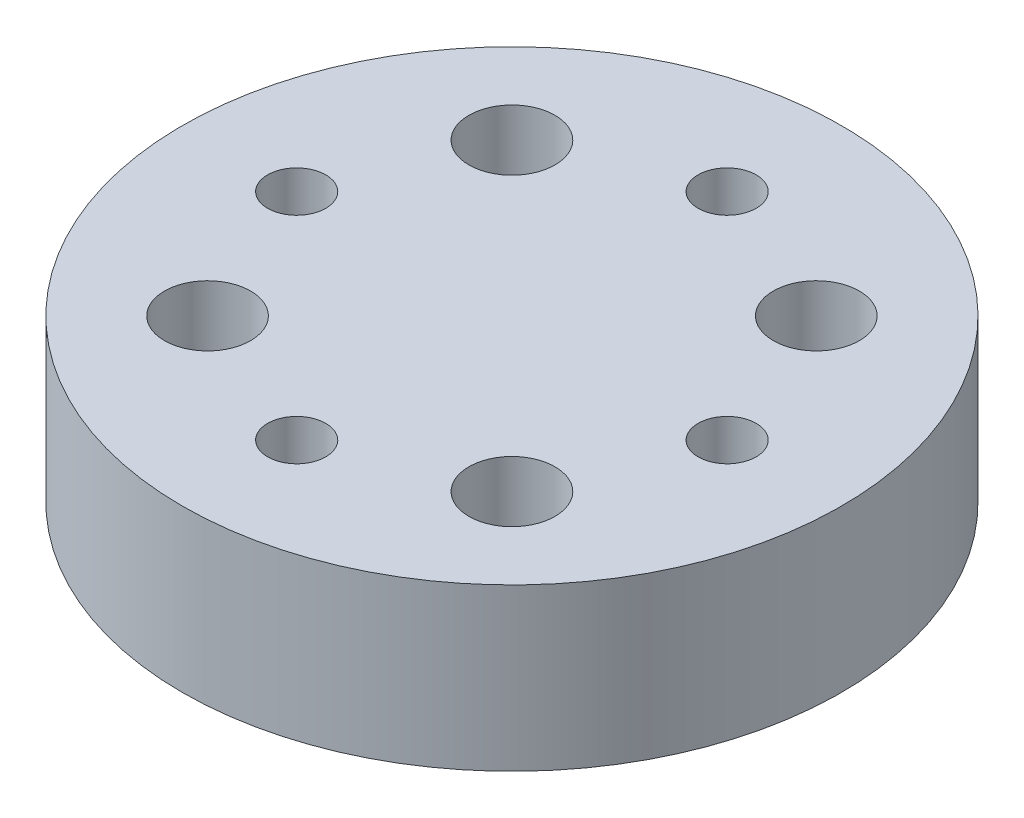
ISO-10303-21;
HEADER;
FILE_DESCRIPTION(('STEP AP214'),'2;1');
FILE_NAME('part.step','',(''),(''),'','','');
FILE_SCHEMA(('AUTOMOTIVE_DESIGN { 1 0 10303 214 1 1 1 1 }'));
ENDSEC;
DATA;
#1=APPLICATION_CONTEXT('core data for automotive mechanical design processes');
#2=APPLICATION_PROTOCOL_DEFINITION('international standard','automotive_design',2000,#1);
#3=PRODUCT_CONTEXT('',#1,'mechanical');
#4=PRODUCT('Part','Part','',(#3));
#5=PRODUCT_RELATED_PRODUCT_CATEGORY('part','',(#4));
#6=PRODUCT_DEFINITION_FORMATION('','',#4);
#7=PRODUCT_DEFINITION_CONTEXT('part definition',#1,'design');
#8=PRODUCT_DEFINITION('design','',#6,#7);
#9=PRODUCT_DEFINITION_SHAPE('','',#8);
#10=(LENGTH_UNIT() NAMED_UNIT(*) SI_UNIT(.MILLI.,.METRE.));
#11=(NAMED_UNIT(*) PLANE_ANGLE_UNIT() SI_UNIT($,.RADIAN.));
#12=(NAMED_UNIT(*) SI_UNIT($,.STERADIAN.) SOLID_ANGLE_UNIT());
#13=UNCERTAINTY_MEASURE_WITH_UNIT(LENGTH_MEASURE(1.E-05),#10,'distance_accuracy_value','');
#14=(GEOMETRIC_REPRESENTATION_CONTEXT(3) GLOBAL_UNCERTAINTY_ASSIGNED_CONTEXT((#13)) GLOBAL_UNIT_ASSIGNED_CONTEXT((#10,
#11,#12)) REPRESENTATION_CONTEXT('',''));
#15=CARTESIAN_POINT('',(0.,0.,0.));
#16=DIRECTION('',(0.,0.,1.));
#17=DIRECTION('',(1.,0.,0.));
#18=AXIS2_PLACEMENT_3D('',#15,#16,#17);
#19=CARTESIAN_POINT('',(0.,6.,0.));
#20=DIRECTION('',(0.,1.,0.));
#21=DIRECTION('',(0.,0.,1.));
#22=AXIS2_PLACEMENT_3D('',#19,#20,#21);
#23=PLANE('',#22);
#24=CARTESIAN_POINT('',(5.6568542494927,6.,5.65685424949206));
#25=DIRECTION('',(0.,1.,0.));
#26=DIRECTION('',(0.,0.,1.));
#27=AXIS2_PLACEMENT_3D('',#24,#25,#26);
#28=CIRCLE('',#27,1.60000000000041);
#29=CARTESIAN_POINT('',(5.6568542494927,6.,7.25685424949247));
#30=VERTEX_POINT('',#29);
#31=EDGE_CURVE('E81',#30,#30,#28,.T.);
#32=ORIENTED_EDGE('',*,*,#31,.F.);
#33=EDGE_LOOP('',(#32));
#34=FACE_BOUND('',#33,.T.);
#35=CARTESIAN_POINT('',(-7.99999999999977,6.,2.27373675443232E-13));
#36=DIRECTION('',(0.,1.,0.));
#37=DIRECTION('',(0.,0.,1.));
#38=AXIS2_PLACEMENT_3D('',#35,#36,#37);
#39=CIRCLE('',#38,1.08);
#40=CARTESIAN_POINT('',(-7.99999999999977,6.,1.08000000000023));
#41=VERTEX_POINT('',#40);
#42=EDGE_CURVE('E69',#41,#41,#39,.T.);
#43=ORIENTED_EDGE('',*,*,#42,.F.);
#44=EDGE_LOOP('',(#43));
#45=FACE_BOUND('',#44,.T.);
#46=CARTESIAN_POINT('',(8.00000000000023,6.,-2.26393958003914E-13));
#47=DIRECTION('',(0.,1.,0.));
#48=DIRECTION('',(0.,0.,1.));
#49=AXIS2_PLACEMENT_3D('',#46,#47,#48);
#50=CIRCLE('',#49,1.08);
#51=CARTESIAN_POINT('',(8.00000000000023,6.,1.07999999999977));
#52=VERTEX_POINT('',#51);
#53=EDGE_CURVE('E57',#52,#52,#50,.T.);
#54=ORIENTED_EDGE('',*,*,#53,.F.);
#55=EDGE_LOOP('',(#54));
#56=FACE_BOUND('',#55,.T.);
#57=CARTESIAN_POINT('',(0.,6.,-8.));
#58=DIRECTION('',(0.,1.,0.));
#59=DIRECTION('',(0.,0.,1.));
#60=AXIS2_PLACEMENT_3D('',#57,#58,#59);
#61=CIRCLE('',#60,1.08);
#62=CARTESIAN_POINT('',(0.,6.,-6.92));
#63=VERTEX_POINT('',#62);
#64=EDGE_CURVE('E46',#63,#63,#61,.T.);
#65=ORIENTED_EDGE('',*,*,#64,.F.);
#66=EDGE_LOOP('',(#65));
#67=FACE_BOUND('',#66,.T.);
#68=CARTESIAN_POINT('',(0.,6.,0.));
#69=DIRECTION('',(0.,1.,0.));
#70=DIRECTION('',(0.,0.,1.));
#71=AXIS2_PLACEMENT_3D('',#68,#69,#70);
#72=CIRCLE('',#71,12.25);
#73=CARTESIAN_POINT('',(0.,6.,12.25));
#74=VERTEX_POINT('',#73);
#75=EDGE_CURVE('E10',#74,#74,#72,.T.);
#76=ORIENTED_EDGE('',*,*,#75,.T.);
#77=EDGE_LOOP('',(#76));
#78=FACE_BOUND('',#77,.T.);
#79=CARTESIAN_POINT('',(-5.65685424949241,6.,-5.65685424949235));
#80=DIRECTION('',(0.,1.,0.));
#81=DIRECTION('',(0.,0.,1.));
#82=AXIS2_PLACEMENT_3D('',#79,#80,#81);
#83=CIRCLE('',#82,1.6);
#84=CARTESIAN_POINT('',(-5.65685424949241,6.,-4.05685424949235));
#85=VERTEX_POINT('',#84);
#86=EDGE_CURVE('E51',#85,#85,#83,.T.);
#87=ORIENTED_EDGE('',*,*,#86,.F.);
#88=EDGE_LOOP('',(#87));
#89=FACE_BOUND('',#88,.T.);
#90=CARTESIAN_POINT('',(4.52787916007828E-13,6.,8.));
#91=DIRECTION('',(0.,1.,0.));
#92=DIRECTION('',(0.,0.,1.));
#93=AXIS2_PLACEMENT_3D('',#90,#91,#92);
#94=CIRCLE('',#93,1.08);
#95=CARTESIAN_POINT('',(4.52787916007828E-13,6.,9.08));
#96=VERTEX_POINT('',#95);
#97=EDGE_CURVE('E63',#96,#96,#94,.T.);
#98=ORIENTED_EDGE('',*,*,#97,.F.);
#99=EDGE_LOOP('',(#98));
#100=FACE_BOUND('',#99,.T.);
#101=CARTESIAN_POINT('',(5.65685424949238,6.,-5.6568542494927));
#102=DIRECTION('',(0.,1.,0.));
#103=DIRECTION('',(0.,0.,1.));
#104=AXIS2_PLACEMENT_3D('',#101,#102,#103);
#105=CIRCLE('',#104,1.60000000000029);
#106=CARTESIAN_POINT('',(5.65685424949238,6.,-4.05685424949241));
#107=VERTEX_POINT('',#106);
#108=EDGE_CURVE('E75',#107,#107,#105,.T.);
#109=ORIENTED_EDGE('',*,*,#108,.F.);
#110=EDGE_LOOP('',(#109));
#111=FACE_BOUND('',#110,.T.);
#112=CARTESIAN_POINT('',(-5.65685424949206,6.,5.65685424949238));
#113=DIRECTION('',(0.,1.,0.));
#114=DIRECTION('',(0.,0.,1.));
#115=AXIS2_PLACEMENT_3D('',#112,#113,#114);
#116=CIRCLE('',#115,1.60000000000013);
#117=CARTESIAN_POINT('',(-5.65685424949206,6.,7.25685424949251));
#118=VERTEX_POINT('',#117);
#119=EDGE_CURVE('E87',#118,#118,#116,.T.);
#120=ORIENTED_EDGE('',*,*,#119,.F.);
#121=EDGE_LOOP('',(#120));
#122=FACE_BOUND('',#121,.T.);
#123=ADVANCED_FACE('F35',(#34,#45,#56,#67,#78,#89,#100,#111,#122),#23,.T.);
#124=CARTESIAN_POINT('',(0.,0.,0.));
#125=DIRECTION('',(0.,1.,0.));
#126=DIRECTION('',(0.,0.,1.));
#127=AXIS2_PLACEMENT_3D('',#124,#125,#126);
#128=PLANE('',#127);
#129=CARTESIAN_POINT('',(0.,0.,0.));
#130=DIRECTION('',(0.,1.,0.));
#131=DIRECTION('',(0.,0.,1.));
#132=AXIS2_PLACEMENT_3D('',#129,#130,#131);
#133=CIRCLE('',#132,12.25);
#134=CARTESIAN_POINT('',(0.,0.,12.25));
#135=VERTEX_POINT('',#134);
#136=EDGE_CURVE('E39',#135,#135,#133,.T.);
#137=ORIENTED_EDGE('',*,*,#136,.F.);
#138=EDGE_LOOP('',(#137));
#139=FACE_BOUND('',#138,.T.);
#140=CARTESIAN_POINT('',(0.,0.,-8.));
#141=DIRECTION('',(0.,1.,0.));
#142=DIRECTION('',(0.,0.,1.));
#143=AXIS2_PLACEMENT_3D('',#140,#141,#142);
#144=CIRCLE('',#143,1.08);
#145=CARTESIAN_POINT('',(0.,0.,-6.92));
#146=VERTEX_POINT('',#145);
#147=EDGE_CURVE('E48',#146,#146,#144,.T.);
#148=ORIENTED_EDGE('',*,*,#147,.T.);
#149=EDGE_LOOP('',(#148));
#150=FACE_BOUND('',#149,.T.);
#151=CARTESIAN_POINT('',(-5.65685424949241,0.,-5.65685424949235));
#152=DIRECTION('',(0.,1.,0.));
#153=DIRECTION('',(0.,0.,1.));
#154=AXIS2_PLACEMENT_3D('',#151,#152,#153);
#155=CIRCLE('',#154,1.6);
#156=CARTESIAN_POINT('',(-5.65685424949241,0.,-4.05685424949235));
#157=VERTEX_POINT('',#156);
#158=EDGE_CURVE('E54',#157,#157,#155,.T.);
#159=ORIENTED_EDGE('',*,*,#158,.T.);
#160=EDGE_LOOP('',(#159));
#161=FACE_BOUND('',#160,.T.);
#162=CARTESIAN_POINT('',(8.00000000000023,0.,-2.26393958003914E-13));
#163=DIRECTION('',(0.,1.,0.));
#164=DIRECTION('',(0.,0.,1.));
#165=AXIS2_PLACEMENT_3D('',#162,#163,#164);
#166=CIRCLE('',#165,1.08);
#167=CARTESIAN_POINT('',(8.00000000000023,0.,1.07999999999977));
#168=VERTEX_POINT('',#167);
#169=EDGE_CURVE('E60',#168,#168,#166,.T.);
#170=ORIENTED_EDGE('',*,*,#169,.T.);
#171=EDGE_LOOP('',(#170));
#172=FACE_BOUND('',#171,.T.);
#173=CARTESIAN_POINT('',(4.52787916007828E-13,0.,8.));
#174=DIRECTION('',(0.,1.,0.));
#175=DIRECTION('',(0.,0.,1.));
#176=AXIS2_PLACEMENT_3D('',#173,#174,#175);
#177=CIRCLE('',#176,1.08);
#178=CARTESIAN_POINT('',(4.52787916007828E-13,0.,9.08));
#179=VERTEX_POINT('',#178);
#180=EDGE_CURVE('E66',#179,#179,#177,.T.);
#181=ORIENTED_EDGE('',*,*,#180,.T.);
#182=EDGE_LOOP('',(#181));
#183=FACE_BOUND('',#182,.T.);
#184=CARTESIAN_POINT('',(-7.99999999999977,0.,2.27373675443232E-13));
#185=DIRECTION('',(0.,1.,0.));
#186=DIRECTION('',(0.,0.,1.));
#187=AXIS2_PLACEMENT_3D('',#184,#185,#186);
#188=CIRCLE('',#187,1.08);
#189=CARTESIAN_POINT('',(-7.99999999999977,0.,1.08000000000023));
#190=VERTEX_POINT('',#189);
#191=EDGE_CURVE('E72',#190,#190,#188,.T.);
#192=ORIENTED_EDGE('',*,*,#191,.T.);
#193=EDGE_LOOP('',(#192));
#194=FACE_BOUND('',#193,.T.);
#195=CARTESIAN_POINT('',(5.65685424949238,0.,-5.6568542494927));
#196=DIRECTION('',(0.,1.,0.));
#197=DIRECTION('',(0.,0.,1.));
#198=AXIS2_PLACEMENT_3D('',#195,#196,#197);
#199=CIRCLE('',#198,1.60000000000029);
#200=CARTESIAN_POINT('',(5.65685424949238,0.,-4.05685424949241));
#201=VERTEX_POINT('',#200);
#202=EDGE_CURVE('E78',#201,#201,#199,.T.);
#203=ORIENTED_EDGE('',*,*,#202,.T.);
#204=EDGE_LOOP('',(#203));
#205=FACE_BOUND('',#204,.T.);
#206=CARTESIAN_POINT('',(5.6568542494927,0.,5.65685424949206));
#207=DIRECTION('',(0.,1.,0.));
#208=DIRECTION('',(0.,0.,1.));
#209=AXIS2_PLACEMENT_3D('',#206,#207,#208);
#210=CIRCLE('',#209,1.60000000000041);
#211=CARTESIAN_POINT('',(5.6568542494927,0.,7.25685424949247));
#212=VERTEX_POINT('',#211);
#213=EDGE_CURVE('E84',#212,#212,#210,.T.);
#214=ORIENTED_EDGE('',*,*,#213,.T.);
#215=EDGE_LOOP('',(#214));
#216=FACE_BOUND('',#215,.T.);
#217=CARTESIAN_POINT('',(-5.65685424949206,0.,5.65685424949238));
#218=DIRECTION('',(0.,1.,0.));
#219=DIRECTION('',(0.,0.,1.));
#220=AXIS2_PLACEMENT_3D('',#217,#218,#219);
#221=CIRCLE('',#220,1.60000000000013);
#222=CARTESIAN_POINT('',(-5.65685424949206,0.,7.25685424949251));
#223=VERTEX_POINT('',#222);
#224=EDGE_CURVE('E90',#223,#223,#221,.T.);
#225=ORIENTED_EDGE('',*,*,#224,.T.);
#226=EDGE_LOOP('',(#225));
#227=FACE_BOUND('',#226,.T.);
#228=ADVANCED_FACE('F100',(#139,#150,#161,#172,#183,#194,#205,#216,#227),#128,.F.);
#229=CARTESIAN_POINT('',(0.,6.,0.));
#230=DIRECTION('',(0.,-1.,0.));
#231=DIRECTION('',(0.,0.,-1.));
#232=AXIS2_PLACEMENT_3D('',#229,#230,#231);
#233=CYLINDRICAL_SURFACE('',#232,12.25);
#234=ORIENTED_EDGE('',*,*,#75,.F.);
#235=EDGE_LOOP('',(#234));
#236=FACE_BOUND('',#235,.T.);
#237=ORIENTED_EDGE('',*,*,#136,.T.);
#238=EDGE_LOOP('',(#237));
#239=FACE_BOUND('',#238,.T.);
#240=ADVANCED_FACE('F37',(#236,#239),#233,.T.);
#241=CARTESIAN_POINT('',(0.,6.,-8.));
#242=DIRECTION('',(0.,-1.,0.));
#243=DIRECTION('',(0.,0.,-1.));
#244=AXIS2_PLACEMENT_3D('',#241,#242,#243);
#245=CYLINDRICAL_SURFACE('',#244,1.08);
#246=ORIENTED_EDGE('',*,*,#64,.T.);
#247=EDGE_LOOP('',(#246));
#248=FACE_BOUND('',#247,.T.);
#249=ORIENTED_EDGE('',*,*,#147,.F.);
#250=EDGE_LOOP('',(#249));
#251=FACE_BOUND('',#250,.T.);
#252=ADVANCED_FACE('F110',(#248,#251),#245,.F.);
#253=CARTESIAN_POINT('',(-5.65685424949241,6.,-5.65685424949235));
#254=DIRECTION('',(0.,-1.,0.));
#255=DIRECTION('',(0.,0.,-1.));
#256=AXIS2_PLACEMENT_3D('',#253,#254,#255);
#257=CYLINDRICAL_SURFACE('',#256,1.6);
#258=ORIENTED_EDGE('',*,*,#86,.T.);
#259=EDGE_LOOP('',(#258));
#260=FACE_BOUND('',#259,.T.);
#261=ORIENTED_EDGE('',*,*,#158,.F.);
#262=EDGE_LOOP('',(#261));
#263=FACE_BOUND('',#262,.T.);
#264=ADVANCED_FACE('F113',(#260,#263),#257,.F.);
#265=CARTESIAN_POINT('',(8.00000000000023,6.,-2.26393958003914E-13));
#266=DIRECTION('',(0.,-1.,0.));
#267=DIRECTION('',(0.,0.,-1.));
#268=AXIS2_PLACEMENT_3D('',#265,#266,#267);
#269=CYLINDRICAL_SURFACE('',#268,1.08);
#270=ORIENTED_EDGE('',*,*,#53,.T.);
#271=EDGE_LOOP('',(#270));
#272=FACE_BOUND('',#271,.T.);
#273=ORIENTED_EDGE('',*,*,#169,.F.);
#274=EDGE_LOOP('',(#273));
#275=FACE_BOUND('',#274,.T.);
#276=ADVANCED_FACE('F117',(#272,#275),#269,.F.);
#277=CARTESIAN_POINT('',(4.52787916007828E-13,6.,8.));
#278=DIRECTION('',(0.,-1.,0.));
#279=DIRECTION('',(0.,0.,-1.));
#280=AXIS2_PLACEMENT_3D('',#277,#278,#279);
#281=CYLINDRICAL_SURFACE('',#280,1.08);
#282=ORIENTED_EDGE('',*,*,#97,.T.);
#283=EDGE_LOOP('',(#282));
#284=FACE_BOUND('',#283,.T.);
#285=ORIENTED_EDGE('',*,*,#180,.F.);
#286=EDGE_LOOP('',(#285));
#287=FACE_BOUND('',#286,.T.);
#288=ADVANCED_FACE('F121',(#284,#287),#281,.F.);
#289=CARTESIAN_POINT('',(-7.99999999999977,6.,2.27373675443232E-13));
#290=DIRECTION('',(0.,-1.,0.));
#291=DIRECTION('',(0.,0.,-1.));
#292=AXIS2_PLACEMENT_3D('',#289,#290,#291);
#293=CYLINDRICAL_SURFACE('',#292,1.08);
#294=ORIENTED_EDGE('',*,*,#42,.T.);
#295=EDGE_LOOP('',(#294));
#296=FACE_BOUND('',#295,.T.);
#297=ORIENTED_EDGE('',*,*,#191,.F.);
#298=EDGE_LOOP('',(#297));
#299=FACE_BOUND('',#298,.T.);
#300=ADVANCED_FACE('F125',(#296,#299),#293,.F.);
#301=CARTESIAN_POINT('',(5.65685424949238,6.,-5.6568542494927));
#302=DIRECTION('',(0.,-1.,0.));
#303=DIRECTION('',(0.,0.,-1.));
#304=AXIS2_PLACEMENT_3D('',#301,#302,#303);
#305=CYLINDRICAL_SURFACE('',#304,1.60000000000029);
#306=ORIENTED_EDGE('',*,*,#108,.T.);
#307=EDGE_LOOP('',(#306));
#308=FACE_BOUND('',#307,.T.);
#309=ORIENTED_EDGE('',*,*,#202,.F.);
#310=EDGE_LOOP('',(#309));
#311=FACE_BOUND('',#310,.T.);
#312=ADVANCED_FACE('F129',(#308,#311),#305,.F.);
#313=CARTESIAN_POINT('',(5.6568542494927,6.,5.65685424949206));
#314=DIRECTION('',(0.,-1.,0.));
#315=DIRECTION('',(0.,0.,-1.));
#316=AXIS2_PLACEMENT_3D('',#313,#314,#315);
#317=CYLINDRICAL_SURFACE('',#316,1.60000000000041);
#318=ORIENTED_EDGE('',*,*,#31,.T.);
#319=EDGE_LOOP('',(#318));
#320=FACE_BOUND('',#319,.T.);
#321=ORIENTED_EDGE('',*,*,#213,.F.);
#322=EDGE_LOOP('',(#321));
#323=FACE_BOUND('',#322,.T.);
#324=ADVANCED_FACE('F133',(#320,#323),#317,.F.);
#325=CARTESIAN_POINT('',(-5.65685424949206,6.,5.65685424949238));
#326=DIRECTION('',(0.,-1.,0.));
#327=DIRECTION('',(0.,0.,-1.));
#328=AXIS2_PLACEMENT_3D('',#325,#326,#327);
#329=CYLINDRICAL_SURFACE('',#328,1.60000000000013);
#330=ORIENTED_EDGE('',*,*,#119,.T.);
#331=EDGE_LOOP('',(#330));
#332=FACE_BOUND('',#331,.T.);
#333=ORIENTED_EDGE('',*,*,#224,.F.);
#334=EDGE_LOOP('',(#333));
#335=FACE_BOUND('',#334,.T.);
#336=ADVANCED_FACE('F96',(#332,#335),#329,.F.);
#337=CLOSED_SHELL('',(#123,#228,#240,#252,#264,#276,#288,#300,#312,#324,#336));
#338=MANIFOLD_SOLID_BREP('B2',#337);
#339=ADVANCED_BREP_SHAPE_REPRESENTATION('',(#18,#338),#14);
#340=SHAPE_DEFINITION_REPRESENTATION(#9,#339);
ENDSEC;
END-ISO-10303-21;
